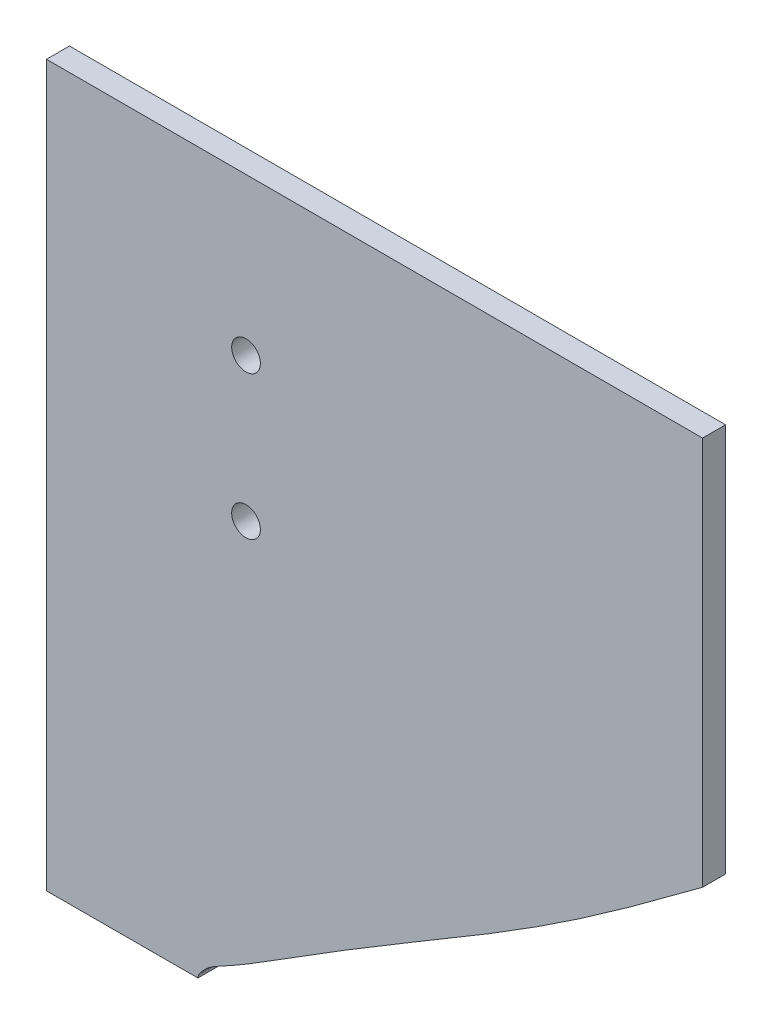
ISO-10303-21;
HEADER;
FILE_DESCRIPTION(('STEP AP214'),'2;1');
FILE_NAME('part.step','',(''),(''),'','','');
FILE_SCHEMA(('AUTOMOTIVE_DESIGN { 1 0 10303 214 1 1 1 1 }'));
ENDSEC;
DATA;
#1=APPLICATION_CONTEXT('core data for automotive mechanical design processes');
#2=APPLICATION_PROTOCOL_DEFINITION('international standard','automotive_design',2000,#1);
#3=PRODUCT_CONTEXT('',#1,'mechanical');
#4=PRODUCT('Part','Part','',(#3));
#5=PRODUCT_RELATED_PRODUCT_CATEGORY('part','',(#4));
#6=PRODUCT_DEFINITION_FORMATION('','',#4);
#7=PRODUCT_DEFINITION_CONTEXT('part definition',#1,'design');
#8=PRODUCT_DEFINITION('design','',#6,#7);
#9=PRODUCT_DEFINITION_SHAPE('','',#8);
#10=(LENGTH_UNIT() NAMED_UNIT(*) SI_UNIT(.MILLI.,.METRE.));
#11=(NAMED_UNIT(*) PLANE_ANGLE_UNIT() SI_UNIT($,.RADIAN.));
#12=(NAMED_UNIT(*) SI_UNIT($,.STERADIAN.) SOLID_ANGLE_UNIT());
#13=UNCERTAINTY_MEASURE_WITH_UNIT(LENGTH_MEASURE(1.E-05),#10,'distance_accuracy_value','');
#14=(GEOMETRIC_REPRESENTATION_CONTEXT(3) GLOBAL_UNCERTAINTY_ASSIGNED_CONTEXT((#13)) GLOBAL_UNIT_ASSIGNED_CONTEXT((#10,
#11,#12)) REPRESENTATION_CONTEXT('',''));
#15=CARTESIAN_POINT('',(0.,0.,0.));
#16=DIRECTION('',(0.,0.,1.));
#17=DIRECTION('',(1.,0.,0.));
#18=AXIS2_PLACEMENT_3D('',#15,#16,#17);
#19=CARTESIAN_POINT('',(-64.1875347752943,-94.8979325486536,75.9999999999997));
#20=DIRECTION('',(0.,0.,-1.));
#21=DIRECTION('',(-1.,0.,0.));
#22=AXIS2_PLACEMENT_3D('',#19,#20,#21);
#23=PLANE('',#22);
#24=CARTESIAN_POINT('',(-100.,-50.,75.9999999999997));
#25=DIRECTION('',(0.,0.,-1.));
#26=DIRECTION('',(-1.,0.,0.));
#27=AXIS2_PLACEMENT_3D('',#24,#25,#26);
#28=CIRCLE('',#27,2.5);
#29=CARTESIAN_POINT('',(-102.5,-50.,75.9999999999997));
#30=VERTEX_POINT('',#29);
#31=EDGE_CURVE('E180',#30,#30,#28,.F.);
#32=ORIENTED_EDGE('',*,*,#31,.T.);
#33=EDGE_LOOP('',(#32));
#34=FACE_BOUND('',#33,.T.);
#35=CARTESIAN_POINT('',(-108.374430082944,-123.024195437747,75.9999999999997));
#36=CARTESIAN_POINT('',(-108.376728274965,-122.987294401247,75.9999999999997));
#37=CARTESIAN_POINT('',(-108.381475231725,-122.911074649759,75.9999999999997));
#38=CARTESIAN_POINT('',(-108.361315294305,-122.791915434402,75.9999999999997));
#39=CARTESIAN_POINT('',(-108.320655915359,-122.663631488063,75.9999999999997));
#40=CARTESIAN_POINT('',(-108.24048188951,-122.490262924161,75.9999999999997));
#41=CARTESIAN_POINT('',(-108.117088866123,-122.287391503248,75.9999999999997));
#42=CARTESIAN_POINT('',(-107.952625042677,-122.053262870405,75.9999999999997));
#43=CARTESIAN_POINT('',(-107.764474359448,-121.804898609912,75.9999999999997));
#44=CARTESIAN_POINT('',(-107.540188460795,-121.531222194494,75.9999999999997));
#45=CARTESIAN_POINT('',(-107.184064785326,-121.138519561637,75.9999999999997));
#46=CARTESIAN_POINT('',(-106.626662430201,-120.613482872918,75.9999999999997));
#47=CARTESIAN_POINT('',(-105.857156708617,-120.059573435753,75.9999999999997));
#48=CARTESIAN_POINT('',(-105.015915350508,-119.548420802456,75.9999999999997));
#49=CARTESIAN_POINT('',(-103.91329716217,-118.938359091636,75.9999999999997));
#50=CARTESIAN_POINT('',(-102.804995502666,-118.358612589993,75.9999999999997));
#51=CARTESIAN_POINT('',(-101.696930123873,-117.756411641577,75.9999999999997));
#52=CARTESIAN_POINT('',(-100.875922508632,-117.287596943484,75.9999999999997));
#53=CARTESIAN_POINT('',(-100.055479118545,-116.798113917265,75.9999999999997));
#54=CARTESIAN_POINT('',(-98.9818590057146,-116.138152078328,75.9999999999997));
#55=CARTESIAN_POINT('',(-97.7426882807085,-115.36414587324,75.9999999999997));
#56=CARTESIAN_POINT('',(-96.2908949967986,-114.459725534079,75.9999999999997));
#57=CARTESIAN_POINT('',(-94.7645078635478,-113.504718038151,75.9999999999997));
#58=CARTESIAN_POINT('',(-93.0650481988617,-112.440987991027,75.9999999999997));
#59=CARTESIAN_POINT('',(-90.7772664151679,-111.005542277386,75.9999999999997));
#60=CARTESIAN_POINT('',(-88.0325109356472,-109.282076571859,75.9999999999997));
#61=CARTESIAN_POINT('',(-83.6887512060784,-106.584161307264,75.9999999999997));
#62=CARTESIAN_POINT('',(-78.3109664481846,-103.298741227297,75.9999999999997));
#63=CARTESIAN_POINT('',(-72.8996243544736,-100.058883352506,75.9999999999997));
#64=CARTESIAN_POINT('',(-68.6249763218911,-97.5243577632004,75.9999999999997));
#65=CARTESIAN_POINT('',(-64.285308090168,-94.9590209146975,75.9999999999997));
#66=CARTESIAN_POINT('',(-58.8751819529338,-91.7416863594238,75.9999999999997));
#67=CARTESIAN_POINT('',(-52.4391780088704,-87.7816710926189,75.9999999999997));
#68=CARTESIAN_POINT('',(-47.1487683989169,-84.3710133764025,75.9999999999997));
#69=CARTESIAN_POINT('',(-42.9640068179857,-81.5740536085003,75.9999999999997));
#70=CARTESIAN_POINT('',(-39.8482076196696,-79.443441719607,75.9999999999997));
#71=CARTESIAN_POINT('',(-36.7536709020996,-77.2816603399841,75.9999999999997));
#72=CARTESIAN_POINT('',(-32.6527479222603,-74.3616883958822,75.9999999999997));
#73=CARTESIAN_POINT('',(-27.5677272927191,-70.6518864215107,75.9999999999997));
#74=CARTESIAN_POINT('',(-23.2108489475738,-67.4153651880807,75.9999999999997));
#75=CARTESIAN_POINT('',(-20.8737443778563,-65.6817087664896,75.9999999999997));
#76=CARTESIAN_POINT('',(-20.5592081045354,-65.4483868017253,75.9999999999997));
#77=B_SPLINE_CURVE_WITH_KNOTS('',3,(#35,#36,#37,#38,#39,#40,#41,#42,#43,#44,#45,#46,#47,#48,#49,
#50,#51,#52,#53,#54,#55,#56,#57,#58,#59,#60,#61,#62,#63,#64,#65,#66,#67,#68,#69,#70,#71,#72,#73,
#74,#75,#76),.UNSPECIFIED.,.F.,.F.,(4,1,1,1,1,1,1,1,1,1,1,1,1,1,1,1,1,1,1,1,1,1,1,1,1,1,1,1,1,1,
1,1,1,1,1,1,1,1,1,4),(0.,0.00105001392556658,0.00216882256040385,0.00341562050687805,
0.00487555187431521,0.00759645305750922,0.0101652191609793,0.0130228897300813,
0.0164683623195763,0.0202386803563663,0.0281159726235332,0.038223535434494,0.047173181579678,
0.056142614430445,0.0741058195904024,0.0827942436286973,0.092057307454932,0.101029000106276,
0.110001331118764,0.127947854631086,0.142638435529158,0.15871435600117,0.179225846268361,
0.199737314057663,0.235632348337101,0.271527311805518,0.345363952846075,0.415105228880575,
0.451148022074114,0.486893938704354,0.558676022234956,0.630409310853194,0.702092552289466,
0.737924682973131,0.773755752126484,0.809589469451969,0.845428590472102,0.917127137385033,
0.988846660220473,1.),.UNSPECIFIED.);
#78=CARTESIAN_POINT('',(-108.374430082944,-123.024195437747,75.9999999999997));
#79=VERTEX_POINT('',#78);
#80=CARTESIAN_POINT('',(-20.5592081045354,-65.4483868017253,75.9999999999997));
#81=VERTEX_POINT('',#80);
#82=EDGE_CURVE('E116',#79,#81,#77,.T.);
#83=ORIENTED_EDGE('',*,*,#82,.F.);
#84=DIRECTION('',(0.999998678714229,0.00162559828869659,0.));
#85=VECTOR('',#84,1.);
#86=CARTESIAN_POINT('',(-108.374430082944,-123.024195437747,75.9999999999997));
#87=LINE('',#86,#85);
#88=CARTESIAN_POINT('',(-134.726652152189,-123.067033621448,75.9999999999997));
#89=VERTEX_POINT('',#88);
#90=EDGE_CURVE('E104',#89,#79,#87,.T.);
#91=ORIENTED_EDGE('',*,*,#90,.F.);
#92=DIRECTION('',(1.103742094063E-08,-1.,0.));
#93=VECTOR('',#92,1.);
#94=CARTESIAN_POINT('',(-134.726652152189,-123.067033621448,75.9999999999997));
#95=LINE('',#94,#93);
#96=CARTESIAN_POINT('',(-134.726653535432,2.25600000000001,75.9999999999997));
#97=VERTEX_POINT('',#96);
#98=EDGE_CURVE('E95',#97,#89,#95,.T.);
#99=ORIENTED_EDGE('',*,*,#98,.F.);
#100=DIRECTION('',(-1.,0.,0.));
#101=VECTOR('',#100,1.);
#102=CARTESIAN_POINT('',(-20.6657378011559,2.25600000000003,75.9999999999997));
#103=LINE('',#102,#101);
#104=CARTESIAN_POINT('',(-20.5588469906557,2.25600000000003,75.9999999999997));
#105=VERTEX_POINT('',#104);
#106=EDGE_CURVE('E87',#105,#97,#103,.T.);
#107=ORIENTED_EDGE('',*,*,#106,.F.);
#108=DIRECTION('',(5.33368510953618E-06,0.999999999985776,0.));
#109=VECTOR('',#108,1.);
#110=CARTESIAN_POINT('',(-20.5588469906557,2.25600000000003,75.9999999999997));
#111=LINE('',#110,#109);
#112=EDGE_CURVE('E96',#81,#105,#111,.T.);
#113=ORIENTED_EDGE('',*,*,#112,.F.);
#114=EDGE_LOOP('',(#83,#91,#99,#107,#113));
#115=FACE_BOUND('',#114,.T.);
#116=CARTESIAN_POINT('',(-100.,-25.,75.9999999999997));
#117=DIRECTION('',(0.,0.,-1.));
#118=DIRECTION('',(-1.,0.,0.));
#119=AXIS2_PLACEMENT_3D('',#116,#117,#118);
#120=CIRCLE('',#119,2.5);
#121=CARTESIAN_POINT('',(-102.5,-25.,75.9999999999997));
#122=VERTEX_POINT('',#121);
#123=EDGE_CURVE('E181',#122,#122,#120,.F.);
#124=ORIENTED_EDGE('',*,*,#123,.T.);
#125=EDGE_LOOP('',(#124));
#126=FACE_BOUND('',#125,.T.);
#127=ADVANCED_FACE('F30',(#34,#115,#126),#23,.T.);
#128=CARTESIAN_POINT('',(-64.1875347752943,-94.8979325486536,79.9999999999997));
#129=DIRECTION('',(0.,0.,-1.));
#130=DIRECTION('',(-1.,0.,0.));
#131=AXIS2_PLACEMENT_3D('',#128,#129,#130);
#132=PLANE('',#131);
#133=CARTESIAN_POINT('',(-100.,-50.,79.9999999999997));
#134=DIRECTION('',(0.,0.,-1.));
#135=DIRECTION('',(-1.,0.,0.));
#136=AXIS2_PLACEMENT_3D('',#133,#134,#135);
#137=CIRCLE('',#136,2.5);
#138=CARTESIAN_POINT('',(-102.5,-50.,79.9999999999997));
#139=VERTEX_POINT('',#138);
#140=EDGE_CURVE('E178',#139,#139,#137,.F.);
#141=ORIENTED_EDGE('',*,*,#140,.F.);
#142=EDGE_LOOP('',(#141));
#143=FACE_BOUND('',#142,.T.);
#144=CARTESIAN_POINT('',(-20.5592081045354,-65.4483868017253,79.9999999999998));
#145=CARTESIAN_POINT('',(-20.8737443778563,-65.6817087664896,79.9999999999998));
#146=CARTESIAN_POINT('',(-23.2108489475738,-67.4153651880807,79.9999999999998));
#147=CARTESIAN_POINT('',(-27.5677272927191,-70.6518864215107,79.9999999999998));
#148=CARTESIAN_POINT('',(-32.6527479222603,-74.3616883958822,79.9999999999998));
#149=CARTESIAN_POINT('',(-36.7536709020996,-77.2816603399841,79.9999999999998));
#150=CARTESIAN_POINT('',(-39.8482076196696,-79.443441719607,79.9999999999998));
#151=CARTESIAN_POINT('',(-42.9640068179857,-81.5740536085003,79.9999999999998));
#152=CARTESIAN_POINT('',(-47.1487683989169,-84.3710133764025,79.9999999999998));
#153=CARTESIAN_POINT('',(-52.4391780088704,-87.7816710926189,79.9999999999998));
#154=CARTESIAN_POINT('',(-58.8751819529338,-91.7416863594238,79.9999999999998));
#155=CARTESIAN_POINT('',(-64.285308090168,-94.9590209146975,79.9999999999998));
#156=CARTESIAN_POINT('',(-68.6249763218911,-97.5243577632004,79.9999999999998));
#157=CARTESIAN_POINT('',(-72.8996243544736,-100.058883352506,79.9999999999998));
#158=CARTESIAN_POINT('',(-78.3109664481846,-103.298741227297,79.9999999999998));
#159=CARTESIAN_POINT('',(-83.6887512060784,-106.584161307264,79.9999999999998));
#160=CARTESIAN_POINT('',(-88.0325109356472,-109.282076571859,79.9999999999998));
#161=CARTESIAN_POINT('',(-90.7772664151679,-111.005542277386,79.9999999999998));
#162=CARTESIAN_POINT('',(-93.0650481988617,-112.440987991027,79.9999999999998));
#163=CARTESIAN_POINT('',(-94.7645078635478,-113.504718038151,79.9999999999998));
#164=CARTESIAN_POINT('',(-96.2908949967986,-114.459725534079,79.9999999999998));
#165=CARTESIAN_POINT('',(-97.7426882807085,-115.36414587324,79.9999999999998));
#166=CARTESIAN_POINT('',(-98.9818590057146,-116.138152078328,79.9999999999998));
#167=CARTESIAN_POINT('',(-100.055479118545,-116.798113917265,79.9999999999998));
#168=CARTESIAN_POINT('',(-100.875922508632,-117.287596943484,79.9999999999998));
#169=CARTESIAN_POINT('',(-101.696930123873,-117.756411641577,79.9999999999998));
#170=CARTESIAN_POINT('',(-102.804995502666,-118.358612589993,79.9999999999998));
#171=CARTESIAN_POINT('',(-103.91329716217,-118.938359091636,79.9999999999998));
#172=CARTESIAN_POINT('',(-105.015915350508,-119.548420802456,79.9999999999998));
#173=CARTESIAN_POINT('',(-105.857156708617,-120.059573435753,79.9999999999998));
#174=CARTESIAN_POINT('',(-106.626662430201,-120.613482872918,79.9999999999998));
#175=CARTESIAN_POINT('',(-107.184064785326,-121.138519561637,79.9999999999998));
#176=CARTESIAN_POINT('',(-107.540188460795,-121.531222194494,79.9999999999998));
#177=CARTESIAN_POINT('',(-107.764474359448,-121.804898609912,79.9999999999998));
#178=CARTESIAN_POINT('',(-107.952625042677,-122.053262870405,79.9999999999998));
#179=CARTESIAN_POINT('',(-108.117088866123,-122.287391503248,79.9999999999998));
#180=CARTESIAN_POINT('',(-108.24048188951,-122.490262924161,79.9999999999998));
#181=CARTESIAN_POINT('',(-108.320655915359,-122.663631488063,79.9999999999998));
#182=CARTESIAN_POINT('',(-108.361315294305,-122.791915434402,79.9999999999998));
#183=CARTESIAN_POINT('',(-108.381475231725,-122.911074649759,79.9999999999998));
#184=CARTESIAN_POINT('',(-108.376728274965,-122.987294401247,79.9999999999998));
#185=CARTESIAN_POINT('',(-108.374430082944,-123.024195437747,79.9999999999998));
#186=B_SPLINE_CURVE_WITH_KNOTS('',3,(#144,#145,#146,#147,#148,#149,#150,#151,#152,#153,#154,
#155,#156,#157,#158,#159,#160,#161,#162,#163,#164,#165,#166,#167,#168,#169,#170,#171,#172,#173,
#174,#175,#176,#177,#178,#179,#180,#181,#182,#183,#184,#185),.UNSPECIFIED.,.F.,.F.,(4,1,1,1,1,1,
1,1,1,1,1,1,1,1,1,1,1,1,1,1,1,1,1,1,1,1,1,1,1,1,1,1,1,1,1,1,1,1,1,4),(0.,0.0111533397795273,
0.0828728626149667,0.154571409527898,0.190410530548031,0.226244247873516,0.262075317026869,
0.297907447710534,0.369590689146806,0.441323977765044,0.513106061295646,0.548851977925886,
0.584894771119425,0.654636047153925,0.728472688194482,0.764367651662899,0.800262685942337,
0.820774153731639,0.84128564399883,0.857361564470842,0.872052145368914,0.889998668881236,
0.898970999893724,0.907942692545068,0.917205756371303,0.925894180409598,0.943857385569555,
0.952826818420322,0.961776464565506,0.971884027376467,0.979761319643634,0.983531637680424,
0.986977110269919,0.989834780839021,0.992403546942491,0.995124448125685,0.996584379493122,
0.997831177439596,0.998949986074433,1.),.UNSPECIFIED.);
#187=CARTESIAN_POINT('',(-108.374430082944,-123.024195437747,79.9999999999997));
#188=VERTEX_POINT('',#187);
#189=CARTESIAN_POINT('',(-20.5592081045354,-65.4483868017253,79.9999999999997));
#190=VERTEX_POINT('',#189);
#191=EDGE_CURVE('E162',#188,#190,#186,.F.);
#192=ORIENTED_EDGE('',*,*,#191,.T.);
#193=DIRECTION('',(5.33368510953618E-06,0.999999999985776,0.));
#194=VECTOR('',#193,1.);
#195=CARTESIAN_POINT('',(-20.5588469906557,2.25600000000003,79.9999999999997));
#196=LINE('',#195,#194);
#197=CARTESIAN_POINT('',(-20.5588469906557,2.25600000000003,79.9999999999997));
#198=VERTEX_POINT('',#197);
#199=EDGE_CURVE('E110',#190,#198,#196,.T.);
#200=ORIENTED_EDGE('',*,*,#199,.T.);
#201=DIRECTION('',(-1.,0.,0.));
#202=VECTOR('',#201,1.);
#203=CARTESIAN_POINT('',(-134.726653535432,2.25600000000001,79.9999999999997));
#204=LINE('',#203,#202);
#205=CARTESIAN_POINT('',(-134.726653535432,2.25600000000001,79.9999999999997));
#206=VERTEX_POINT('',#205);
#207=EDGE_CURVE('E108',#198,#206,#204,.T.);
#208=ORIENTED_EDGE('',*,*,#207,.T.);
#209=DIRECTION('',(1.103742094063E-08,-1.,0.));
#210=VECTOR('',#209,1.);
#211=CARTESIAN_POINT('',(-134.726652152189,-123.067033621448,79.9999999999997));
#212=LINE('',#211,#210);
#213=CARTESIAN_POINT('',(-134.726652152189,-123.067033621448,79.9999999999997));
#214=VERTEX_POINT('',#213);
#215=EDGE_CURVE('E100',#206,#214,#212,.T.);
#216=ORIENTED_EDGE('',*,*,#215,.T.);
#217=DIRECTION('',(0.999998678714229,0.00162559828869659,0.));
#218=VECTOR('',#217,1.);
#219=CARTESIAN_POINT('',(-108.374430082944,-123.024195437747,79.9999999999997));
#220=LINE('',#219,#218);
#221=EDGE_CURVE('E112',#214,#188,#220,.T.);
#222=ORIENTED_EDGE('',*,*,#221,.T.);
#223=EDGE_LOOP('',(#192,#200,#208,#216,#222));
#224=FACE_BOUND('',#223,.T.);
#225=CARTESIAN_POINT('',(-100.,-25.,79.9999999999997));
#226=DIRECTION('',(0.,0.,-1.));
#227=DIRECTION('',(-1.,0.,0.));
#228=AXIS2_PLACEMENT_3D('',#225,#226,#227);
#229=CIRCLE('',#228,2.5);
#230=CARTESIAN_POINT('',(-102.5,-25.,79.9999999999997));
#231=VERTEX_POINT('',#230);
#232=EDGE_CURVE('E36',#231,#231,#229,.F.);
#233=ORIENTED_EDGE('',*,*,#232,.F.);
#234=EDGE_LOOP('',(#233));
#235=FACE_BOUND('',#234,.T.);
#236=ADVANCED_FACE('F139',(#143,#224,#235),#132,.F.);
#237=CARTESIAN_POINT('',(-108.374430082944,-123.024195437747,75.9999999999997));
#238=CARTESIAN_POINT('',(-108.376728274965,-122.987294401247,75.9999999999997));
#239=CARTESIAN_POINT('',(-108.381475231725,-122.911074649759,75.9999999999997));
#240=CARTESIAN_POINT('',(-108.361315294305,-122.791915434402,75.9999999999997));
#241=CARTESIAN_POINT('',(-108.320655915359,-122.663631488063,75.9999999999997));
#242=CARTESIAN_POINT('',(-108.24048188951,-122.490262924161,75.9999999999997));
#243=CARTESIAN_POINT('',(-108.117088866123,-122.287391503248,75.9999999999997));
#244=CARTESIAN_POINT('',(-107.952625042677,-122.053262870405,75.9999999999997));
#245=CARTESIAN_POINT('',(-107.764474359448,-121.804898609912,75.9999999999997));
#246=CARTESIAN_POINT('',(-107.540188460795,-121.531222194494,75.9999999999997));
#247=CARTESIAN_POINT('',(-107.184064785326,-121.138519561637,75.9999999999997));
#248=CARTESIAN_POINT('',(-106.626662430201,-120.613482872918,75.9999999999997));
#249=CARTESIAN_POINT('',(-105.857156708617,-120.059573435753,75.9999999999997));
#250=CARTESIAN_POINT('',(-105.015915350508,-119.548420802456,75.9999999999997));
#251=CARTESIAN_POINT('',(-103.91329716217,-118.938359091636,75.9999999999997));
#252=CARTESIAN_POINT('',(-102.804995502666,-118.358612589993,75.9999999999997));
#253=CARTESIAN_POINT('',(-101.696930123873,-117.756411641577,75.9999999999997));
#254=CARTESIAN_POINT('',(-100.875922508632,-117.287596943484,75.9999999999997));
#255=CARTESIAN_POINT('',(-100.055479118545,-116.798113917265,75.9999999999997));
#256=CARTESIAN_POINT('',(-98.9818590057146,-116.138152078328,75.9999999999997));
#257=CARTESIAN_POINT('',(-97.7426882807085,-115.36414587324,75.9999999999997));
#258=CARTESIAN_POINT('',(-96.2908949967986,-114.459725534079,75.9999999999997));
#259=CARTESIAN_POINT('',(-94.7645078635478,-113.504718038151,75.9999999999997));
#260=CARTESIAN_POINT('',(-93.0650481988617,-112.440987991027,75.9999999999997));
#261=CARTESIAN_POINT('',(-90.7772664151679,-111.005542277386,75.9999999999997));
#262=CARTESIAN_POINT('',(-88.0325109356472,-109.282076571859,75.9999999999997));
#263=CARTESIAN_POINT('',(-83.6887512060784,-106.584161307264,75.9999999999997));
#264=CARTESIAN_POINT('',(-78.3109664481846,-103.298741227297,75.9999999999997));
#265=CARTESIAN_POINT('',(-72.8996243544736,-100.058883352506,75.9999999999997));
#266=CARTESIAN_POINT('',(-68.6249763218911,-97.5243577632004,75.9999999999997));
#267=CARTESIAN_POINT('',(-64.285308090168,-94.9590209146975,75.9999999999997));
#268=CARTESIAN_POINT('',(-58.8751819529338,-91.7416863594238,75.9999999999997));
#269=CARTESIAN_POINT('',(-52.4391780088704,-87.7816710926189,75.9999999999997));
#270=CARTESIAN_POINT('',(-47.1487683989169,-84.3710133764025,75.9999999999997));
#271=CARTESIAN_POINT('',(-42.9640068179857,-81.5740536085003,75.9999999999997));
#272=CARTESIAN_POINT('',(-39.8482076196696,-79.443441719607,75.9999999999997));
#273=CARTESIAN_POINT('',(-36.7536709020996,-77.2816603399841,75.9999999999997));
#274=CARTESIAN_POINT('',(-32.6527479222603,-74.3616883958822,75.9999999999997));
#275=CARTESIAN_POINT('',(-27.5677272927191,-70.6518864215107,75.9999999999997));
#276=CARTESIAN_POINT('',(-23.2108489475738,-67.4153651880807,75.9999999999997));
#277=CARTESIAN_POINT('',(-20.8737443778563,-65.6817087664896,75.9999999999997));
#278=CARTESIAN_POINT('',(-20.5592081045354,-65.4483868017253,75.9999999999997));
#279=B_SPLINE_CURVE_WITH_KNOTS('',3,(#237,#238,#239,#240,#241,#242,#243,#244,#245,#246,#247,
#248,#249,#250,#251,#252,#253,#254,#255,#256,#257,#258,#259,#260,#261,#262,#263,#264,#265,#266,
#267,#268,#269,#270,#271,#272,#273,#274,#275,#276,#277,#278),.UNSPECIFIED.,.F.,.F.,(4,1,1,1,1,1,
1,1,1,1,1,1,1,1,1,1,1,1,1,1,1,1,1,1,1,1,1,1,1,1,1,1,1,1,1,1,1,1,1,4),(0.,0.00105001392556658,
0.00216882256040385,0.00341562050687805,0.00487555187431521,0.00759645305750922,
0.0101652191609793,0.0130228897300813,0.0164683623195763,0.0202386803563663,0.0281159726235332,
0.038223535434494,0.047173181579678,0.056142614430445,0.0741058195904024,0.0827942436286973,
0.092057307454932,0.101029000106276,0.110001331118764,0.127947854631086,0.142638435529158,
0.15871435600117,0.179225846268361,0.199737314057663,0.235632348337101,0.271527311805518,
0.345363952846075,0.415105228880575,0.451148022074114,0.486893938704354,0.558676022234956,
0.630409310853194,0.702092552289466,0.737924682973131,0.773755752126484,0.809589469451969,
0.845428590472102,0.917127137385033,0.988846660220473,1.),.UNSPECIFIED.);
#280=DIRECTION('',(0.,0.,1.));
#281=VECTOR('',#280,1.);
#282=SURFACE_OF_LINEAR_EXTRUSION('',#279,#281);
#283=ORIENTED_EDGE('',*,*,#191,.F.);
#284=DIRECTION('',(0.,0.,1.));
#285=VECTOR('',#284,1.);
#286=CARTESIAN_POINT('',(-108.374430082944,-123.024195437747,75.9999999999997));
#287=LINE('',#286,#285);
#288=EDGE_CURVE('E11',#79,#188,#287,.T.);
#289=ORIENTED_EDGE('',*,*,#288,.F.);
#290=ORIENTED_EDGE('',*,*,#82,.T.);
#291=DIRECTION('',(0.,0.,1.));
#292=VECTOR('',#291,1.);
#293=CARTESIAN_POINT('',(-20.5592081045354,-65.4483868017253,75.9999999999997));
#294=LINE('',#293,#292);
#295=EDGE_CURVE('E80',#81,#190,#294,.T.);
#296=ORIENTED_EDGE('',*,*,#295,.T.);
#297=EDGE_LOOP('',(#283,#289,#290,#296));
#298=FACE_BOUND('',#297,.T.);
#299=ADVANCED_FACE('F32',(#298),#282,.T.);
#300=CARTESIAN_POINT('',(-108.374430082944,-123.024195437747,75.9999999999997));
#301=DIRECTION('',(0.00162559828869659,-0.999998678714229,0.));
#302=DIRECTION('',(0.999998678714229,0.00162559828869659,0.));
#303=AXIS2_PLACEMENT_3D('',#300,#301,#302);
#304=PLANE('',#303);
#305=ORIENTED_EDGE('',*,*,#221,.F.);
#306=DIRECTION('',(0.,0.,1.));
#307=VECTOR('',#306,1.);
#308=CARTESIAN_POINT('',(-134.726652152189,-123.067033621448,75.9999999999997));
#309=LINE('',#308,#307);
#310=EDGE_CURVE('E42',#89,#214,#309,.T.);
#311=ORIENTED_EDGE('',*,*,#310,.F.);
#312=ORIENTED_EDGE('',*,*,#90,.T.);
#313=ORIENTED_EDGE('',*,*,#288,.T.);
#314=EDGE_LOOP('',(#305,#311,#312,#313));
#315=FACE_BOUND('',#314,.T.);
#316=ADVANCED_FACE('F147',(#315),#304,.T.);
#317=CARTESIAN_POINT('',(-134.726652152189,-123.067033621448,75.9999999999997));
#318=DIRECTION('',(-1.,-1.103742094063E-08,0.));
#319=DIRECTION('',(1.103742094063E-08,-1.,0.));
#320=AXIS2_PLACEMENT_3D('',#317,#318,#319);
#321=PLANE('',#320);
#322=ORIENTED_EDGE('',*,*,#215,.F.);
#323=DIRECTION('',(0.,0.,1.));
#324=VECTOR('',#323,1.);
#325=CARTESIAN_POINT('',(-134.726653535432,2.25600000000001,75.9999999999997));
#326=LINE('',#325,#324);
#327=EDGE_CURVE('E90',#97,#206,#326,.T.);
#328=ORIENTED_EDGE('',*,*,#327,.F.);
#329=ORIENTED_EDGE('',*,*,#98,.T.);
#330=ORIENTED_EDGE('',*,*,#310,.T.);
#331=EDGE_LOOP('',(#322,#328,#329,#330));
#332=FACE_BOUND('',#331,.T.);
#333=ADVANCED_FACE('F98',(#332),#321,.T.);
#334=CARTESIAN_POINT('',(-134.726653535432,2.25600000000001,75.9999999999997));
#335=DIRECTION('',(0.,1.,0.));
#336=DIRECTION('',(-1.,0.,0.));
#337=AXIS2_PLACEMENT_3D('',#334,#335,#336);
#338=PLANE('',#337);
#339=ORIENTED_EDGE('',*,*,#207,.F.);
#340=DIRECTION('',(0.,0.,1.));
#341=VECTOR('',#340,1.);
#342=CARTESIAN_POINT('',(-20.5588469906557,2.25600000000003,75.9999999999997));
#343=LINE('',#342,#341);
#344=EDGE_CURVE('E92',#105,#198,#343,.T.);
#345=ORIENTED_EDGE('',*,*,#344,.F.);
#346=ORIENTED_EDGE('',*,*,#106,.T.);
#347=ORIENTED_EDGE('',*,*,#327,.T.);
#348=EDGE_LOOP('',(#339,#345,#346,#347));
#349=FACE_BOUND('',#348,.T.);
#350=ADVANCED_FACE('F89',(#349),#338,.T.);
#351=CARTESIAN_POINT('',(-20.5588469906557,2.25600000000003,75.9999999999997));
#352=DIRECTION('',(0.999999999985776,-5.33368510953618E-06,0.));
#353=DIRECTION('',(5.33368510953618E-06,0.999999999985776,0.));
#354=AXIS2_PLACEMENT_3D('',#351,#352,#353);
#355=PLANE('',#354);
#356=ORIENTED_EDGE('',*,*,#199,.F.);
#357=ORIENTED_EDGE('',*,*,#295,.F.);
#358=ORIENTED_EDGE('',*,*,#112,.T.);
#359=ORIENTED_EDGE('',*,*,#344,.T.);
#360=EDGE_LOOP('',(#356,#357,#358,#359));
#361=FACE_BOUND('',#360,.T.);
#362=ADVANCED_FACE('F205',(#361),#355,.T.);
#363=CARTESIAN_POINT('',(-100.,-50.,308.));
#364=DIRECTION('',(0.,0.,-1.));
#365=DIRECTION('',(-1.,0.,0.));
#366=AXIS2_PLACEMENT_3D('',#363,#364,#365);
#367=CYLINDRICAL_SURFACE('',#366,2.5);
#368=ORIENTED_EDGE('',*,*,#31,.F.);
#369=EDGE_LOOP('',(#368));
#370=FACE_BOUND('',#369,.T.);
#371=ORIENTED_EDGE('',*,*,#140,.T.);
#372=EDGE_LOOP('',(#371));
#373=FACE_BOUND('',#372,.T.);
#374=ADVANCED_FACE('F141',(#370,#373),#367,.F.);
#375=CARTESIAN_POINT('',(-100.,-25.,308.));
#376=DIRECTION('',(0.,0.,-1.));
#377=DIRECTION('',(-1.,0.,0.));
#378=AXIS2_PLACEMENT_3D('',#375,#376,#377);
#379=CYLINDRICAL_SURFACE('',#378,2.5);
#380=ORIENTED_EDGE('',*,*,#123,.F.);
#381=EDGE_LOOP('',(#380));
#382=FACE_BOUND('',#381,.T.);
#383=ORIENTED_EDGE('',*,*,#232,.T.);
#384=EDGE_LOOP('',(#383));
#385=FACE_BOUND('',#384,.T.);
#386=ADVANCED_FACE('F198',(#382,#385),#379,.F.);
#387=CLOSED_SHELL('',(#127,#236,#299,#316,#333,#350,#362,#374,#386));
#388=MANIFOLD_SOLID_BREP('B2',#387);
#389=ADVANCED_BREP_SHAPE_REPRESENTATION('',(#18,#388),#14);
#390=SHAPE_DEFINITION_REPRESENTATION(#9,#389);
ENDSEC;
END-ISO-10303-21;
